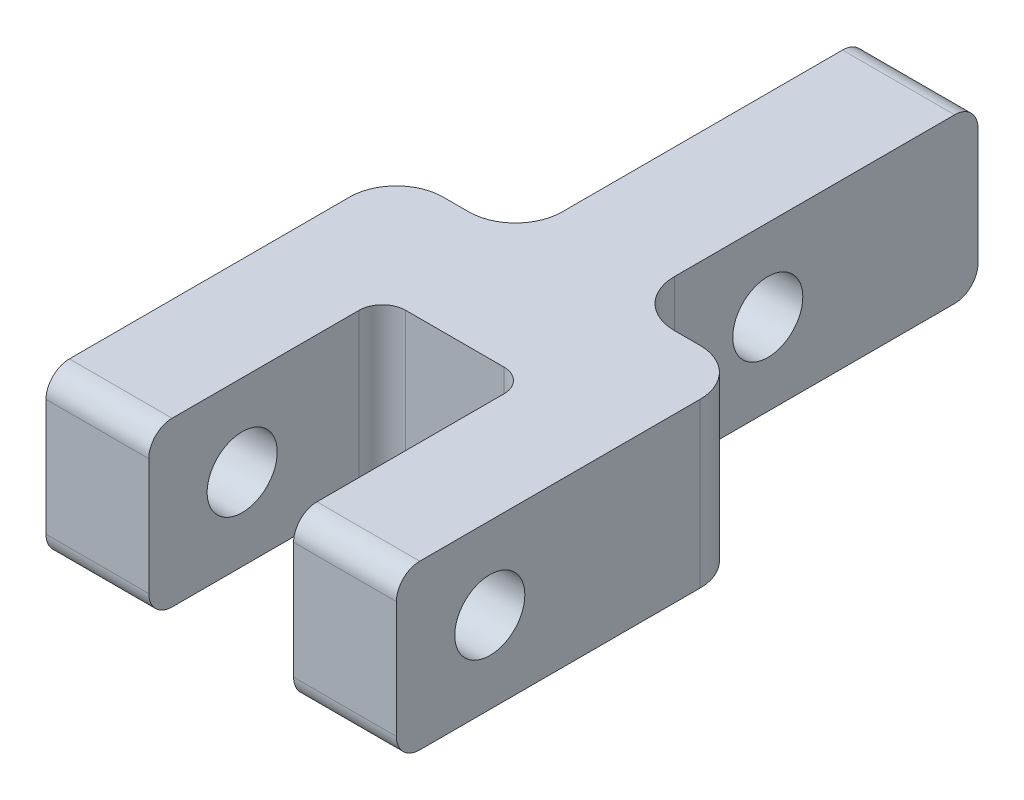
ISO-10303-21;
HEADER;
FILE_DESCRIPTION(('STEP AP214'),'2;1');
FILE_NAME('part.step','',(''),(''),'','','');
FILE_SCHEMA(('AUTOMOTIVE_DESIGN { 1 0 10303 214 1 1 1 1 }'));
ENDSEC;
DATA;
#1=APPLICATION_CONTEXT('core data for automotive mechanical design processes');
#2=APPLICATION_PROTOCOL_DEFINITION('international standard','automotive_design',2000,#1);
#3=PRODUCT_CONTEXT('',#1,'mechanical');
#4=PRODUCT('Part','Part','',(#3));
#5=PRODUCT_RELATED_PRODUCT_CATEGORY('part','',(#4));
#6=PRODUCT_DEFINITION_FORMATION('','',#4);
#7=PRODUCT_DEFINITION_CONTEXT('part definition',#1,'design');
#8=PRODUCT_DEFINITION('design','',#6,#7);
#9=PRODUCT_DEFINITION_SHAPE('','',#8);
#10=(LENGTH_UNIT() NAMED_UNIT(*) SI_UNIT(.MILLI.,.METRE.));
#11=(NAMED_UNIT(*) PLANE_ANGLE_UNIT() SI_UNIT($,.RADIAN.));
#12=(NAMED_UNIT(*) SI_UNIT($,.STERADIAN.) SOLID_ANGLE_UNIT());
#13=UNCERTAINTY_MEASURE_WITH_UNIT(LENGTH_MEASURE(1.E-05),#10,'distance_accuracy_value','');
#14=(GEOMETRIC_REPRESENTATION_CONTEXT(3) GLOBAL_UNCERTAINTY_ASSIGNED_CONTEXT((#13)) GLOBAL_UNIT_ASSIGNED_CONTEXT((#10,
#11,#12)) REPRESENTATION_CONTEXT('',''));
#15=CARTESIAN_POINT('',(0.,0.,0.));
#16=DIRECTION('',(0.,0.,1.));
#17=DIRECTION('',(1.,0.,0.));
#18=AXIS2_PLACEMENT_3D('',#15,#16,#17);
#19=CARTESIAN_POINT('',(2.4,-2.5,14.));
#20=DIRECTION('',(-1.,0.,0.));
#21=DIRECTION('',(0.,0.,1.));
#22=AXIS2_PLACEMENT_3D('',#19,#20,#21);
#23=CYLINDRICAL_SURFACE('',#22,0.999999999999999);
#24=CARTESIAN_POINT('',(-3.1,-2.5,14.));
#25=DIRECTION('',(1.,0.,0.));
#26=DIRECTION('',(0.,0.,-1.));
#27=AXIS2_PLACEMENT_3D('',#24,#25,#26);
#28=CIRCLE('',#27,0.999999999999999);
#29=CARTESIAN_POINT('',(-3.1,-2.5,15.));
#30=VERTEX_POINT('',#29);
#31=CARTESIAN_POINT('',(-3.1,-3.5,14.));
#32=VERTEX_POINT('',#31);
#33=EDGE_CURVE('E213',#30,#32,#28,.T.);
#34=ORIENTED_EDGE('',*,*,#33,.F.);
#35=DIRECTION('',(-1.,0.,0.));
#36=VECTOR('',#35,1.);
#37=CARTESIAN_POINT('',(2.4,-2.5,15.));
#38=LINE('',#37,#36);
#39=CARTESIAN_POINT('',(-7.5,-2.5,15.));
#40=VERTEX_POINT('',#39);
#41=EDGE_CURVE('E212',#30,#40,#38,.T.);
#42=ORIENTED_EDGE('',*,*,#41,.T.);
#43=CARTESIAN_POINT('',(-7.5,-2.5,14.));
#44=DIRECTION('',(1.,0.,0.));
#45=DIRECTION('',(0.,0.,-1.));
#46=AXIS2_PLACEMENT_3D('',#43,#44,#45);
#47=CIRCLE('',#46,0.999999999999999);
#48=CARTESIAN_POINT('',(-7.5,-3.5,14.));
#49=VERTEX_POINT('',#48);
#50=EDGE_CURVE('E358',#40,#49,#47,.T.);
#51=ORIENTED_EDGE('',*,*,#50,.T.);
#52=DIRECTION('',(-1.,0.,0.));
#53=VECTOR('',#52,1.);
#54=CARTESIAN_POINT('',(2.4,-3.5,14.));
#55=LINE('',#54,#53);
#56=EDGE_CURVE('E243',#32,#49,#55,.T.);
#57=ORIENTED_EDGE('',*,*,#56,.F.);
#58=EDGE_LOOP('',(#34,#42,#51,#57));
#59=FACE_BOUND('',#58,.T.);
#60=ADVANCED_FACE('F32',(#59),#23,.T.);
#61=CARTESIAN_POINT('',(2.4,-3.5,14.));
#62=DIRECTION('',(0.,1.,0.));
#63=DIRECTION('',(0.,0.,1.));
#64=AXIS2_PLACEMENT_3D('',#61,#62,#63);
#65=PLANE('',#64);
#66=DIRECTION('',(-1.,0.,0.));
#67=VECTOR('',#66,1.);
#68=CARTESIAN_POINT('',(7.5,-3.5,0.));
#69=LINE('',#68,#67);
#70=CARTESIAN_POINT('',(5.5,-3.5,0.));
#71=VERTEX_POINT('',#70);
#72=CARTESIAN_POINT('',(4.4,-3.5,0.));
#73=VERTEX_POINT('',#72);
#74=EDGE_CURVE('E371',#71,#73,#69,.T.);
#75=ORIENTED_EDGE('',*,*,#74,.F.);
#76=CARTESIAN_POINT('',(5.5,-3.5,2.));
#77=DIRECTION('',(0.,1.,0.));
#78=DIRECTION('',(0.,0.,1.));
#79=AXIS2_PLACEMENT_3D('',#76,#77,#78);
#80=CIRCLE('',#79,2.);
#81=CARTESIAN_POINT('',(7.5,-3.5,2.));
#82=VERTEX_POINT('',#81);
#83=EDGE_CURVE('E268',#71,#82,#80,.F.);
#84=ORIENTED_EDGE('',*,*,#83,.T.);
#85=DIRECTION('',(0.,0.,-1.));
#86=VECTOR('',#85,1.);
#87=CARTESIAN_POINT('',(7.5,-3.5,0.));
#88=LINE('',#87,#86);
#89=CARTESIAN_POINT('',(7.5,-3.5,14.));
#90=VERTEX_POINT('',#89);
#91=EDGE_CURVE('E349',#90,#82,#88,.T.);
#92=ORIENTED_EDGE('',*,*,#91,.F.);
#93=CARTESIAN_POINT('',(3.1,-3.5,14.));
#94=VERTEX_POINT('',#93);
#95=EDGE_CURVE('E244',#90,#94,#55,.T.);
#96=ORIENTED_EDGE('',*,*,#95,.T.);
#97=DIRECTION('',(0.,0.,-1.));
#98=VECTOR('',#97,1.);
#99=CARTESIAN_POINT('',(3.1,-3.5,4.99999999999999));
#100=LINE('',#99,#98);
#101=CARTESIAN_POINT('',(3.1,-3.5,5.99999999999999));
#102=VERTEX_POINT('',#101);
#103=EDGE_CURVE('E329',#94,#102,#100,.T.);
#104=ORIENTED_EDGE('',*,*,#103,.T.);
#105=CARTESIAN_POINT('',(2.1,-3.5,5.99999999999999));
#106=DIRECTION('',(0.,1.,0.));
#107=DIRECTION('',(0.,0.,1.));
#108=AXIS2_PLACEMENT_3D('',#105,#106,#107);
#109=CIRCLE('',#108,1.);
#110=CARTESIAN_POINT('',(2.1,-3.5,4.99999999999999));
#111=VERTEX_POINT('',#110);
#112=EDGE_CURVE('E302',#102,#111,#109,.T.);
#113=ORIENTED_EDGE('',*,*,#112,.T.);
#114=DIRECTION('',(1.,0.,0.));
#115=VECTOR('',#114,1.);
#116=CARTESIAN_POINT('',(-3.1,-3.5,4.99999999999999));
#117=LINE('',#116,#115);
#118=CARTESIAN_POINT('',(-2.1,-3.5,4.99999999999999));
#119=VERTEX_POINT('',#118);
#120=EDGE_CURVE('E312',#119,#111,#117,.T.);
#121=ORIENTED_EDGE('',*,*,#120,.F.);
#122=CARTESIAN_POINT('',(-2.1,-3.5,5.99999999999999));
#123=DIRECTION('',(0.,1.,0.));
#124=DIRECTION('',(0.,0.,1.));
#125=AXIS2_PLACEMENT_3D('',#122,#123,#124);
#126=CIRCLE('',#125,1.);
#127=CARTESIAN_POINT('',(-3.1,-3.5,5.99999999999999));
#128=VERTEX_POINT('',#127);
#129=EDGE_CURVE('E11',#119,#128,#126,.T.);
#130=ORIENTED_EDGE('',*,*,#129,.T.);
#131=DIRECTION('',(0.,0.,-1.));
#132=VECTOR('',#131,1.);
#133=CARTESIAN_POINT('',(-3.1,-3.5,4.99999999999999));
#134=LINE('',#133,#132);
#135=EDGE_CURVE('E314',#32,#128,#134,.T.);
#136=ORIENTED_EDGE('',*,*,#135,.F.);
#137=ORIENTED_EDGE('',*,*,#56,.T.);
#138=DIRECTION('',(0.,0.,-1.));
#139=VECTOR('',#138,1.);
#140=CARTESIAN_POINT('',(-7.5,-3.5,0.));
#141=LINE('',#140,#139);
#142=CARTESIAN_POINT('',(-7.5,-3.5,2.));
#143=VERTEX_POINT('',#142);
#144=EDGE_CURVE('E361',#49,#143,#141,.T.);
#145=ORIENTED_EDGE('',*,*,#144,.T.);
#146=CARTESIAN_POINT('',(-5.5,-3.5,2.));
#147=DIRECTION('',(0.,1.,0.));
#148=DIRECTION('',(0.,0.,1.));
#149=AXIS2_PLACEMENT_3D('',#146,#147,#148);
#150=CIRCLE('',#149,2.);
#151=CARTESIAN_POINT('',(-5.5,-3.5,0.));
#152=VERTEX_POINT('',#151);
#153=EDGE_CURVE('E266',#143,#152,#150,.F.);
#154=ORIENTED_EDGE('',*,*,#153,.T.);
#155=CARTESIAN_POINT('',(-4.4,-3.5,0.));
#156=VERTEX_POINT('',#155);
#157=EDGE_CURVE('E368',#156,#152,#69,.T.);
#158=ORIENTED_EDGE('',*,*,#157,.F.);
#159=CARTESIAN_POINT('',(-4.4,-3.5,-2.));
#160=DIRECTION('',(0.,1.,0.));
#161=DIRECTION('',(0.,0.,1.));
#162=AXIS2_PLACEMENT_3D('',#159,#160,#161);
#163=CIRCLE('',#162,2.);
#164=CARTESIAN_POINT('',(-2.4,-3.5,-2.));
#165=VERTEX_POINT('',#164);
#166=EDGE_CURVE('E287',#156,#165,#163,.T.);
#167=ORIENTED_EDGE('',*,*,#166,.T.);
#168=DIRECTION('',(0.,0.,-1.));
#169=VECTOR('',#168,1.);
#170=CARTESIAN_POINT('',(-2.4,-3.5,14.));
#171=LINE('',#170,#169);
#172=CARTESIAN_POINT('',(-2.4,-3.5,-14.));
#173=VERTEX_POINT('',#172);
#174=EDGE_CURVE('E378',#165,#173,#171,.T.);
#175=ORIENTED_EDGE('',*,*,#174,.T.);
#176=DIRECTION('',(-1.,0.,0.));
#177=VECTOR('',#176,1.);
#178=CARTESIAN_POINT('',(2.4,-3.5,-14.));
#179=LINE('',#178,#177);
#180=CARTESIAN_POINT('',(2.4,-3.5,-14.));
#181=VERTEX_POINT('',#180);
#182=EDGE_CURVE('E240',#181,#173,#179,.T.);
#183=ORIENTED_EDGE('',*,*,#182,.F.);
#184=DIRECTION('',(0.,0.,-1.));
#185=VECTOR('',#184,1.);
#186=CARTESIAN_POINT('',(2.4,-3.5,14.));
#187=LINE('',#186,#185);
#188=CARTESIAN_POINT('',(2.4,-3.5,-1.99999999999999));
#189=VERTEX_POINT('',#188);
#190=EDGE_CURVE('E379',#189,#181,#187,.T.);
#191=ORIENTED_EDGE('',*,*,#190,.F.);
#192=CARTESIAN_POINT('',(4.4,-3.5,-2.));
#193=DIRECTION('',(0.,1.,0.));
#194=DIRECTION('',(0.,0.,1.));
#195=AXIS2_PLACEMENT_3D('',#192,#193,#194);
#196=CIRCLE('',#195,2.);
#197=EDGE_CURVE('E283',#189,#73,#196,.T.);
#198=ORIENTED_EDGE('',*,*,#197,.T.);
#199=EDGE_LOOP('',(#75,#84,#92,#96,#104,#113,#121,#130,#136,#137,#145,#154,#158,#167,#175,#183,
#191,#198));
#200=FACE_BOUND('',#199,.T.);
#201=ADVANCED_FACE('F414',(#200),#65,.F.);
#202=CARTESIAN_POINT('',(2.4,3.5,14.));
#203=DIRECTION('',(0.,-1.,0.));
#204=DIRECTION('',(0.,0.,-1.));
#205=AXIS2_PLACEMENT_3D('',#202,#203,#204);
#206=PLANE('',#205);
#207=DIRECTION('',(0.,0.,1.));
#208=VECTOR('',#207,1.);
#209=CARTESIAN_POINT('',(7.5,3.5,14.));
#210=LINE('',#209,#208);
#211=CARTESIAN_POINT('',(7.5,3.5,2.));
#212=VERTEX_POINT('',#211);
#213=CARTESIAN_POINT('',(7.5,3.5,14.));
#214=VERTEX_POINT('',#213);
#215=EDGE_CURVE('E352',#212,#214,#210,.T.);
#216=ORIENTED_EDGE('',*,*,#215,.F.);
#217=CARTESIAN_POINT('',(5.5,3.5,2.));
#218=DIRECTION('',(0.,-1.,0.));
#219=DIRECTION('',(0.,0.,-1.));
#220=AXIS2_PLACEMENT_3D('',#217,#218,#219);
#221=CIRCLE('',#220,2.);
#222=CARTESIAN_POINT('',(5.5,3.5,0.));
#223=VERTEX_POINT('',#222);
#224=EDGE_CURVE('E260',#212,#223,#221,.F.);
#225=ORIENTED_EDGE('',*,*,#224,.T.);
#226=DIRECTION('',(-1.,0.,0.));
#227=VECTOR('',#226,1.);
#228=CARTESIAN_POINT('',(7.5,3.5,0.));
#229=LINE('',#228,#227);
#230=CARTESIAN_POINT('',(4.4,3.5,0.));
#231=VERTEX_POINT('',#230);
#232=EDGE_CURVE('E367',#223,#231,#229,.T.);
#233=ORIENTED_EDGE('',*,*,#232,.T.);
#234=CARTESIAN_POINT('',(4.4,3.5,-2.));
#235=DIRECTION('',(0.,-1.,0.));
#236=DIRECTION('',(0.,0.,-1.));
#237=AXIS2_PLACEMENT_3D('',#234,#235,#236);
#238=CIRCLE('',#237,2.);
#239=CARTESIAN_POINT('',(2.4,3.5,-1.99999999999999));
#240=VERTEX_POINT('',#239);
#241=EDGE_CURVE('E285',#231,#240,#238,.T.);
#242=ORIENTED_EDGE('',*,*,#241,.T.);
#243=DIRECTION('',(0.,0.,1.));
#244=VECTOR('',#243,1.);
#245=CARTESIAN_POINT('',(2.4,3.5,14.));
#246=LINE('',#245,#244);
#247=CARTESIAN_POINT('',(2.4,3.5,-14.));
#248=VERTEX_POINT('',#247);
#249=EDGE_CURVE('E388',#248,#240,#246,.T.);
#250=ORIENTED_EDGE('',*,*,#249,.F.);
#251=DIRECTION('',(-1.,0.,0.));
#252=VECTOR('',#251,1.);
#253=CARTESIAN_POINT('',(2.4,3.5,-14.));
#254=LINE('',#253,#252);
#255=CARTESIAN_POINT('',(-2.4,3.5,-14.));
#256=VERTEX_POINT('',#255);
#257=EDGE_CURVE('E231',#248,#256,#254,.T.);
#258=ORIENTED_EDGE('',*,*,#257,.T.);
#259=DIRECTION('',(0.,0.,1.));
#260=VECTOR('',#259,1.);
#261=CARTESIAN_POINT('',(-2.4,3.5,14.));
#262=LINE('',#261,#260);
#263=CARTESIAN_POINT('',(-2.4,3.5,-1.99999999999999));
#264=VERTEX_POINT('',#263);
#265=EDGE_CURVE('E382',#256,#264,#262,.T.);
#266=ORIENTED_EDGE('',*,*,#265,.T.);
#267=CARTESIAN_POINT('',(-4.4,3.5,-2.));
#268=DIRECTION('',(0.,-1.,0.));
#269=DIRECTION('',(0.,0.,-1.));
#270=AXIS2_PLACEMENT_3D('',#267,#268,#269);
#271=CIRCLE('',#270,2.);
#272=CARTESIAN_POINT('',(-4.4,3.5,0.));
#273=VERTEX_POINT('',#272);
#274=EDGE_CURVE('E289',#264,#273,#271,.T.);
#275=ORIENTED_EDGE('',*,*,#274,.T.);
#276=CARTESIAN_POINT('',(-5.5,3.5,0.));
#277=VERTEX_POINT('',#276);
#278=EDGE_CURVE('E354',#273,#277,#229,.T.);
#279=ORIENTED_EDGE('',*,*,#278,.T.);
#280=CARTESIAN_POINT('',(-5.5,3.5,2.));
#281=DIRECTION('',(0.,-1.,0.));
#282=DIRECTION('',(0.,0.,-1.));
#283=AXIS2_PLACEMENT_3D('',#280,#281,#282);
#284=CIRCLE('',#283,2.);
#285=CARTESIAN_POINT('',(-7.5,3.5,2.));
#286=VERTEX_POINT('',#285);
#287=EDGE_CURVE('E258',#277,#286,#284,.F.);
#288=ORIENTED_EDGE('',*,*,#287,.T.);
#289=DIRECTION('',(0.,0.,1.));
#290=VECTOR('',#289,1.);
#291=CARTESIAN_POINT('',(-7.5,3.5,14.));
#292=LINE('',#291,#290);
#293=CARTESIAN_POINT('',(-7.5,3.5,14.));
#294=VERTEX_POINT('',#293);
#295=EDGE_CURVE('E343',#286,#294,#292,.T.);
#296=ORIENTED_EDGE('',*,*,#295,.T.);
#297=DIRECTION('',(-1.,0.,0.));
#298=VECTOR('',#297,1.);
#299=CARTESIAN_POINT('',(2.4,3.5,14.));
#300=LINE('',#299,#298);
#301=CARTESIAN_POINT('',(-3.1,3.5,14.));
#302=VERTEX_POINT('',#301);
#303=EDGE_CURVE('E223',#302,#294,#300,.T.);
#304=ORIENTED_EDGE('',*,*,#303,.F.);
#305=DIRECTION('',(0.,0.,1.));
#306=VECTOR('',#305,1.);
#307=CARTESIAN_POINT('',(-3.1,3.5,14.));
#308=LINE('',#307,#306);
#309=CARTESIAN_POINT('',(-3.1,3.5,5.99999999999999));
#310=VERTEX_POINT('',#309);
#311=EDGE_CURVE('E199',#310,#302,#308,.T.);
#312=ORIENTED_EDGE('',*,*,#311,.F.);
#313=CARTESIAN_POINT('',(-2.1,3.5,5.99999999999999));
#314=DIRECTION('',(0.,-1.,0.));
#315=DIRECTION('',(0.,0.,-1.));
#316=AXIS2_PLACEMENT_3D('',#313,#314,#315);
#317=CIRCLE('',#316,1.);
#318=CARTESIAN_POINT('',(-2.1,3.5,4.99999999999999));
#319=VERTEX_POINT('',#318);
#320=EDGE_CURVE('E40',#310,#319,#317,.T.);
#321=ORIENTED_EDGE('',*,*,#320,.T.);
#322=DIRECTION('',(1.,0.,0.));
#323=VECTOR('',#322,1.);
#324=CARTESIAN_POINT('',(-3.1,3.5,4.99999999999999));
#325=LINE('',#324,#323);
#326=CARTESIAN_POINT('',(2.1,3.5,4.99999999999999));
#327=VERTEX_POINT('',#326);
#328=EDGE_CURVE('E252',#319,#327,#325,.T.);
#329=ORIENTED_EDGE('',*,*,#328,.T.);
#330=CARTESIAN_POINT('',(2.1,3.5,5.99999999999999));
#331=DIRECTION('',(0.,-1.,0.));
#332=DIRECTION('',(0.,0.,-1.));
#333=AXIS2_PLACEMENT_3D('',#330,#331,#332);
#334=CIRCLE('',#333,1.);
#335=CARTESIAN_POINT('',(3.1,3.5,5.99999999999999));
#336=VERTEX_POINT('',#335);
#337=EDGE_CURVE('E300',#327,#336,#334,.T.);
#338=ORIENTED_EDGE('',*,*,#337,.T.);
#339=DIRECTION('',(0.,0.,1.));
#340=VECTOR('',#339,1.);
#341=CARTESIAN_POINT('',(3.1,3.5,14.));
#342=LINE('',#341,#340);
#343=CARTESIAN_POINT('',(3.1,3.5,14.));
#344=VERTEX_POINT('',#343);
#345=EDGE_CURVE('E204',#336,#344,#342,.T.);
#346=ORIENTED_EDGE('',*,*,#345,.T.);
#347=EDGE_CURVE('E228',#214,#344,#300,.T.);
#348=ORIENTED_EDGE('',*,*,#347,.F.);
#349=EDGE_LOOP('',(#216,#225,#233,#242,#250,#258,#266,#275,#279,#288,#296,#304,#312,#321,#329,
#338,#346,#348));
#350=FACE_BOUND('',#349,.T.);
#351=ADVANCED_FACE('F307',(#350),#206,.F.);
#352=CARTESIAN_POINT('',(2.4,2.5,14.));
#353=DIRECTION('',(-1.,0.,0.));
#354=DIRECTION('',(0.,0.,1.));
#355=AXIS2_PLACEMENT_3D('',#352,#353,#354);
#356=CYLINDRICAL_SURFACE('',#355,0.999999999999999);
#357=CARTESIAN_POINT('',(-3.1,2.5,14.));
#358=DIRECTION('',(1.,0.,0.));
#359=DIRECTION('',(0.,0.,-1.));
#360=AXIS2_PLACEMENT_3D('',#357,#358,#359);
#361=CIRCLE('',#360,0.999999999999998);
#362=CARTESIAN_POINT('',(-3.1,2.5,15.));
#363=VERTEX_POINT('',#362);
#364=EDGE_CURVE('E192',#302,#363,#361,.T.);
#365=ORIENTED_EDGE('',*,*,#364,.F.);
#366=ORIENTED_EDGE('',*,*,#303,.T.);
#367=CARTESIAN_POINT('',(-7.5,2.5,14.));
#368=DIRECTION('',(1.,0.,0.));
#369=DIRECTION('',(0.,0.,-1.));
#370=AXIS2_PLACEMENT_3D('',#367,#368,#369);
#371=CIRCLE('',#370,0.999999999999998);
#372=CARTESIAN_POINT('',(-7.5,2.5,15.));
#373=VERTEX_POINT('',#372);
#374=EDGE_CURVE('E218',#294,#373,#371,.T.);
#375=ORIENTED_EDGE('',*,*,#374,.T.);
#376=DIRECTION('',(-1.,0.,0.));
#377=VECTOR('',#376,1.);
#378=CARTESIAN_POINT('',(2.4,2.5,15.));
#379=LINE('',#378,#377);
#380=EDGE_CURVE('E210',#363,#373,#379,.T.);
#381=ORIENTED_EDGE('',*,*,#380,.F.);
#382=EDGE_LOOP('',(#365,#366,#375,#381));
#383=FACE_BOUND('',#382,.T.);
#384=ADVANCED_FACE('F216',(#383),#356,.T.);
#385=CARTESIAN_POINT('',(2.4,2.5,15.));
#386=DIRECTION('',(0.,0.,-1.));
#387=DIRECTION('',(-1.,0.,0.));
#388=AXIS2_PLACEMENT_3D('',#385,#386,#387);
#389=PLANE('',#388);
#390=DIRECTION('',(0.,-1.,0.));
#391=VECTOR('',#390,1.);
#392=CARTESIAN_POINT('',(-3.1,2.5,15.));
#393=LINE('',#392,#391);
#394=EDGE_CURVE('E196',#363,#30,#393,.T.);
#395=ORIENTED_EDGE('',*,*,#394,.F.);
#396=ORIENTED_EDGE('',*,*,#380,.T.);
#397=DIRECTION('',(0.,-1.,0.));
#398=VECTOR('',#397,1.);
#399=CARTESIAN_POINT('',(-7.5,2.5,15.));
#400=LINE('',#399,#398);
#401=EDGE_CURVE('E356',#373,#40,#400,.T.);
#402=ORIENTED_EDGE('',*,*,#401,.T.);
#403=ORIENTED_EDGE('',*,*,#41,.F.);
#404=EDGE_LOOP('',(#395,#396,#402,#403));
#405=FACE_BOUND('',#404,.T.);
#406=ADVANCED_FACE('F208',(#405),#389,.F.);
#407=CARTESIAN_POINT('',(-2.4,0.,11.));
#408=DIRECTION('',(1.,0.,0.));
#409=DIRECTION('',(0.,0.,-1.));
#410=AXIS2_PLACEMENT_3D('',#407,#408,#409);
#411=CYLINDRICAL_SURFACE('',#410,1.5);
#412=CARTESIAN_POINT('',(-7.5,0.,11.));
#413=DIRECTION('',(1.,0.,0.));
#414=DIRECTION('',(0.,0.,-1.));
#415=AXIS2_PLACEMENT_3D('',#412,#413,#414);
#416=CIRCLE('',#415,1.5);
#417=CARTESIAN_POINT('',(-7.5,0.,9.49999999999999));
#418=VERTEX_POINT('',#417);
#419=EDGE_CURVE('E255',#418,#418,#416,.T.);
#420=ORIENTED_EDGE('',*,*,#419,.F.);
#421=EDGE_LOOP('',(#420));
#422=FACE_BOUND('',#421,.T.);
#423=CARTESIAN_POINT('',(-3.1,0.,11.));
#424=DIRECTION('',(1.,0.,0.));
#425=DIRECTION('',(0.,0.,-1.));
#426=AXIS2_PLACEMENT_3D('',#423,#424,#425);
#427=CIRCLE('',#426,1.5);
#428=CARTESIAN_POINT('',(-3.1,0.,9.49999999999999));
#429=VERTEX_POINT('',#428);
#430=EDGE_CURVE('E251',#429,#429,#427,.F.);
#431=ORIENTED_EDGE('',*,*,#430,.F.);
#432=EDGE_LOOP('',(#431));
#433=FACE_BOUND('',#432,.T.);
#434=ADVANCED_FACE('F514',(#422,#433),#411,.F.);
#435=CARTESIAN_POINT('',(2.4,-2.5,14.));
#436=DIRECTION('',(1.,0.,0.));
#437=DIRECTION('',(0.,0.,-1.));
#438=AXIS2_PLACEMENT_3D('',#435,#436,#437);
#439=PLANE('',#438);
#440=CARTESIAN_POINT('',(2.4,0.,-6.));
#441=DIRECTION('',(1.,0.,0.));
#442=DIRECTION('',(0.,0.,-1.));
#443=AXIS2_PLACEMENT_3D('',#440,#441,#442);
#444=CIRCLE('',#443,1.5);
#445=CARTESIAN_POINT('',(2.4,0.,-7.5));
#446=VERTEX_POINT('',#445);
#447=EDGE_CURVE('E372',#446,#446,#444,.T.);
#448=ORIENTED_EDGE('',*,*,#447,.F.);
#449=EDGE_LOOP('',(#448));
#450=FACE_BOUND('',#449,.T.);
#451=ORIENTED_EDGE('',*,*,#249,.T.);
#452=DIRECTION('',(0.,-1.,0.));
#453=VECTOR('',#452,1.);
#454=CARTESIAN_POINT('',(2.4,-2.5,-2.));
#455=LINE('',#454,#453);
#456=EDGE_CURVE('E278',#240,#189,#455,.T.);
#457=ORIENTED_EDGE('',*,*,#456,.T.);
#458=ORIENTED_EDGE('',*,*,#190,.T.);
#459=CARTESIAN_POINT('',(2.4,-2.5,-14.));
#460=DIRECTION('',(1.,0.,0.));
#461=DIRECTION('',(0.,0.,-1.));
#462=AXIS2_PLACEMENT_3D('',#459,#460,#461);
#463=CIRCLE('',#462,1.);
#464=CARTESIAN_POINT('',(2.4,-2.5,-15.));
#465=VERTEX_POINT('',#464);
#466=EDGE_CURVE('E381',#181,#465,#463,.T.);
#467=ORIENTED_EDGE('',*,*,#466,.T.);
#468=DIRECTION('',(0.,1.,0.));
#469=VECTOR('',#468,1.);
#470=CARTESIAN_POINT('',(2.4,2.5,-15.));
#471=LINE('',#470,#469);
#472=CARTESIAN_POINT('',(2.4,2.5,-15.));
#473=VERTEX_POINT('',#472);
#474=EDGE_CURVE('E384',#465,#473,#471,.T.);
#475=ORIENTED_EDGE('',*,*,#474,.T.);
#476=CARTESIAN_POINT('',(2.4,2.5,-14.));
#477=DIRECTION('',(1.,0.,0.));
#478=DIRECTION('',(0.,0.,1.));
#479=AXIS2_PLACEMENT_3D('',#476,#477,#478);
#480=CIRCLE('',#479,1.);
#481=EDGE_CURVE('E386',#473,#248,#480,.T.);
#482=ORIENTED_EDGE('',*,*,#481,.T.);
#483=EDGE_LOOP('',(#451,#457,#458,#467,#475,#482));
#484=FACE_BOUND('',#483,.T.);
#485=ADVANCED_FACE('F446',(#450,#484),#439,.T.);
#486=CARTESIAN_POINT('',(-2.4,-2.5,14.));
#487=DIRECTION('',(1.,0.,0.));
#488=DIRECTION('',(0.,0.,-1.));
#489=AXIS2_PLACEMENT_3D('',#486,#487,#488);
#490=PLANE('',#489);
#491=CARTESIAN_POINT('',(-2.4,0.,-6.));
#492=DIRECTION('',(1.,0.,0.));
#493=DIRECTION('',(0.,0.,-1.));
#494=AXIS2_PLACEMENT_3D('',#491,#492,#493);
#495=CIRCLE('',#494,1.5);
#496=CARTESIAN_POINT('',(-2.4,0.,-7.5));
#497=VERTEX_POINT('',#496);
#498=EDGE_CURVE('E375',#497,#497,#495,.T.);
#499=ORIENTED_EDGE('',*,*,#498,.T.);
#500=EDGE_LOOP('',(#499));
#501=FACE_BOUND('',#500,.T.);
#502=ORIENTED_EDGE('',*,*,#174,.F.);
#503=DIRECTION('',(0.,-1.,0.));
#504=VECTOR('',#503,1.);
#505=CARTESIAN_POINT('',(-2.4,3.5,-2.));
#506=LINE('',#505,#504);
#507=EDGE_CURVE('E281',#165,#264,#506,.F.);
#508=ORIENTED_EDGE('',*,*,#507,.T.);
#509=ORIENTED_EDGE('',*,*,#265,.F.);
#510=CARTESIAN_POINT('',(-2.4,2.5,-14.));
#511=DIRECTION('',(1.,0.,0.));
#512=DIRECTION('',(0.,0.,1.));
#513=AXIS2_PLACEMENT_3D('',#510,#511,#512);
#514=CIRCLE('',#513,1.);
#515=CARTESIAN_POINT('',(-2.4,2.5,-15.));
#516=VERTEX_POINT('',#515);
#517=EDGE_CURVE('E396',#516,#256,#514,.T.);
#518=ORIENTED_EDGE('',*,*,#517,.F.);
#519=DIRECTION('',(0.,1.,0.));
#520=VECTOR('',#519,1.);
#521=CARTESIAN_POINT('',(-2.4,2.5,-15.));
#522=LINE('',#521,#520);
#523=CARTESIAN_POINT('',(-2.4,-2.5,-15.));
#524=VERTEX_POINT('',#523);
#525=EDGE_CURVE('E394',#524,#516,#522,.T.);
#526=ORIENTED_EDGE('',*,*,#525,.F.);
#527=CARTESIAN_POINT('',(-2.4,-2.5,-14.));
#528=DIRECTION('',(1.,0.,0.));
#529=DIRECTION('',(0.,0.,-1.));
#530=AXIS2_PLACEMENT_3D('',#527,#528,#529);
#531=CIRCLE('',#530,1.);
#532=EDGE_CURVE('E392',#173,#524,#531,.T.);
#533=ORIENTED_EDGE('',*,*,#532,.F.);
#534=EDGE_LOOP('',(#502,#508,#509,#518,#526,#533));
#535=FACE_BOUND('',#534,.T.);
#536=ADVANCED_FACE('F437',(#501,#535),#490,.F.);
#537=CARTESIAN_POINT('',(7.5,-2.5,15.));
#538=VERTEX_POINT('',#537);
#539=CARTESIAN_POINT('',(3.1,-2.5,15.));
#540=VERTEX_POINT('',#539);
#541=EDGE_CURVE('E220',#538,#540,#38,.T.);
#542=ORIENTED_EDGE('',*,*,#541,.T.);
#543=CARTESIAN_POINT('',(3.1,-2.5,14.));
#544=DIRECTION('',(1.,0.,0.));
#545=DIRECTION('',(0.,0.,-1.));
#546=AXIS2_PLACEMENT_3D('',#543,#544,#545);
#547=CIRCLE('',#546,0.999999999999999);
#548=EDGE_CURVE('E326',#540,#94,#547,.T.);
#549=ORIENTED_EDGE('',*,*,#548,.T.);
#550=ORIENTED_EDGE('',*,*,#95,.F.);
#551=CARTESIAN_POINT('',(7.5,-2.5,14.));
#552=DIRECTION('',(1.,0.,0.));
#553=DIRECTION('',(0.,0.,-1.));
#554=AXIS2_PLACEMENT_3D('',#551,#552,#553);
#555=CIRCLE('',#554,0.999999999999999);
#556=EDGE_CURVE('E346',#538,#90,#555,.T.);
#557=ORIENTED_EDGE('',*,*,#556,.F.);
#558=EDGE_LOOP('',(#542,#549,#550,#557));
#559=FACE_BOUND('',#558,.T.);
#560=ADVANCED_FACE('F429',(#559),#23,.T.);
#561=CARTESIAN_POINT('',(2.4,-2.5,-14.));
#562=DIRECTION('',(-1.,0.,0.));
#563=DIRECTION('',(0.,0.,1.));
#564=AXIS2_PLACEMENT_3D('',#561,#562,#563);
#565=CYLINDRICAL_SURFACE('',#564,1.);
#566=ORIENTED_EDGE('',*,*,#532,.T.);
#567=DIRECTION('',(-1.,0.,0.));
#568=VECTOR('',#567,1.);
#569=CARTESIAN_POINT('',(2.4,-2.5,-15.));
#570=LINE('',#569,#568);
#571=EDGE_CURVE('E237',#465,#524,#570,.T.);
#572=ORIENTED_EDGE('',*,*,#571,.F.);
#573=ORIENTED_EDGE('',*,*,#466,.F.);
#574=ORIENTED_EDGE('',*,*,#182,.T.);
#575=EDGE_LOOP('',(#566,#572,#573,#574));
#576=FACE_BOUND('',#575,.T.);
#577=ADVANCED_FACE('F436',(#576),#565,.T.);
#578=CARTESIAN_POINT('',(2.4,2.5,-15.));
#579=DIRECTION('',(0.,0.,1.));
#580=DIRECTION('',(1.,0.,0.));
#581=AXIS2_PLACEMENT_3D('',#578,#579,#580);
#582=PLANE('',#581);
#583=ORIENTED_EDGE('',*,*,#525,.T.);
#584=DIRECTION('',(-1.,0.,0.));
#585=VECTOR('',#584,1.);
#586=CARTESIAN_POINT('',(2.4,2.5,-15.));
#587=LINE('',#586,#585);
#588=EDGE_CURVE('E234',#473,#516,#587,.T.);
#589=ORIENTED_EDGE('',*,*,#588,.F.);
#590=ORIENTED_EDGE('',*,*,#474,.F.);
#591=ORIENTED_EDGE('',*,*,#571,.T.);
#592=EDGE_LOOP('',(#583,#589,#590,#591));
#593=FACE_BOUND('',#592,.T.);
#594=ADVANCED_FACE('F443',(#593),#582,.F.);
#595=CARTESIAN_POINT('',(2.4,2.5,-14.));
#596=DIRECTION('',(-1.,0.,0.));
#597=DIRECTION('',(0.,0.,1.));
#598=AXIS2_PLACEMENT_3D('',#595,#596,#597);
#599=CYLINDRICAL_SURFACE('',#598,1.);
#600=ORIENTED_EDGE('',*,*,#517,.T.);
#601=ORIENTED_EDGE('',*,*,#257,.F.);
#602=ORIENTED_EDGE('',*,*,#481,.F.);
#603=ORIENTED_EDGE('',*,*,#588,.T.);
#604=EDGE_LOOP('',(#600,#601,#602,#603));
#605=FACE_BOUND('',#604,.T.);
#606=ADVANCED_FACE('F491',(#605),#599,.T.);
#607=ORIENTED_EDGE('',*,*,#347,.T.);
#608=CARTESIAN_POINT('',(3.1,2.5,14.));
#609=DIRECTION('',(1.,0.,0.));
#610=DIRECTION('',(0.,0.,-1.));
#611=AXIS2_PLACEMENT_3D('',#608,#609,#610);
#612=CIRCLE('',#611,0.999999999999998);
#613=CARTESIAN_POINT('',(3.1,2.5,15.));
#614=VERTEX_POINT('',#613);
#615=EDGE_CURVE('E320',#344,#614,#612,.T.);
#616=ORIENTED_EDGE('',*,*,#615,.T.);
#617=CARTESIAN_POINT('',(7.5,2.5,15.));
#618=VERTEX_POINT('',#617);
#619=EDGE_CURVE('E219',#618,#614,#379,.T.);
#620=ORIENTED_EDGE('',*,*,#619,.F.);
#621=CARTESIAN_POINT('',(7.5,2.5,14.));
#622=DIRECTION('',(1.,0.,0.));
#623=DIRECTION('',(0.,0.,-1.));
#624=AXIS2_PLACEMENT_3D('',#621,#622,#623);
#625=CIRCLE('',#624,0.999999999999998);
#626=EDGE_CURVE('E339',#214,#618,#625,.T.);
#627=ORIENTED_EDGE('',*,*,#626,.F.);
#628=EDGE_LOOP('',(#607,#616,#620,#627));
#629=FACE_BOUND('',#628,.T.);
#630=ADVANCED_FACE('F460',(#629),#356,.T.);
#631=ORIENTED_EDGE('',*,*,#619,.T.);
#632=DIRECTION('',(0.,-1.,0.));
#633=VECTOR('',#632,1.);
#634=CARTESIAN_POINT('',(3.1,2.5,15.));
#635=LINE('',#634,#633);
#636=EDGE_CURVE('E323',#614,#540,#635,.T.);
#637=ORIENTED_EDGE('',*,*,#636,.T.);
#638=ORIENTED_EDGE('',*,*,#541,.F.);
#639=DIRECTION('',(0.,-1.,0.));
#640=VECTOR('',#639,1.);
#641=CARTESIAN_POINT('',(7.5,2.5,15.));
#642=LINE('',#641,#640);
#643=EDGE_CURVE('E342',#618,#538,#642,.T.);
#644=ORIENTED_EDGE('',*,*,#643,.F.);
#645=EDGE_LOOP('',(#631,#637,#638,#644));
#646=FACE_BOUND('',#645,.T.);
#647=ADVANCED_FACE('F452',(#646),#389,.F.);
#648=CARTESIAN_POINT('',(-2.4,0.,-6.));
#649=DIRECTION('',(1.,0.,0.));
#650=DIRECTION('',(0.,0.,-1.));
#651=AXIS2_PLACEMENT_3D('',#648,#649,#650);
#652=CYLINDRICAL_SURFACE('',#651,1.5);
#653=ORIENTED_EDGE('',*,*,#498,.F.);
#654=EDGE_LOOP('',(#653));
#655=FACE_BOUND('',#654,.T.);
#656=ORIENTED_EDGE('',*,*,#447,.T.);
#657=EDGE_LOOP('',(#656));
#658=FACE_BOUND('',#657,.T.);
#659=ADVANCED_FACE('F510',(#655,#658),#652,.F.);
#660=CARTESIAN_POINT('',(7.5,3.5,0.));
#661=DIRECTION('',(0.,0.,1.));
#662=DIRECTION('',(0.,-1.,0.));
#663=AXIS2_PLACEMENT_3D('',#660,#661,#662);
#664=PLANE('',#663);
#665=ORIENTED_EDGE('',*,*,#157,.T.);
#666=DIRECTION('',(0.,1.,0.));
#667=VECTOR('',#666,1.);
#668=CARTESIAN_POINT('',(-5.5,3.5,0.));
#669=LINE('',#668,#667);
#670=EDGE_CURVE('E273',#152,#277,#669,.T.);
#671=ORIENTED_EDGE('',*,*,#670,.T.);
#672=ORIENTED_EDGE('',*,*,#278,.F.);
#673=DIRECTION('',(0.,-1.,0.));
#674=VECTOR('',#673,1.);
#675=CARTESIAN_POINT('',(-4.4,-3.5,0.));
#676=LINE('',#675,#674);
#677=EDGE_CURVE('E270',#273,#156,#676,.T.);
#678=ORIENTED_EDGE('',*,*,#677,.T.);
#679=EDGE_LOOP('',(#665,#671,#672,#678));
#680=FACE_BOUND('',#679,.T.);
#681=ADVANCED_FACE('F411',(#680),#664,.F.);
#682=CARTESIAN_POINT('',(-7.5,2.5,14.));
#683=DIRECTION('',(1.,0.,0.));
#684=DIRECTION('',(0.,0.,-1.));
#685=AXIS2_PLACEMENT_3D('',#682,#683,#684);
#686=PLANE('',#685);
#687=ORIENTED_EDGE('',*,*,#295,.F.);
#688=DIRECTION('',(0.,1.,0.));
#689=VECTOR('',#688,1.);
#690=CARTESIAN_POINT('',(-7.5,2.5,2.));
#691=LINE('',#690,#689);
#692=EDGE_CURVE('E276',#286,#143,#691,.F.);
#693=ORIENTED_EDGE('',*,*,#692,.T.);
#694=ORIENTED_EDGE('',*,*,#144,.F.);
#695=ORIENTED_EDGE('',*,*,#50,.F.);
#696=ORIENTED_EDGE('',*,*,#401,.F.);
#697=ORIENTED_EDGE('',*,*,#374,.F.);
#698=EDGE_LOOP('',(#687,#693,#694,#695,#696,#697));
#699=FACE_BOUND('',#698,.T.);
#700=ORIENTED_EDGE('',*,*,#419,.T.);
#701=EDGE_LOOP('',(#700));
#702=FACE_BOUND('',#701,.T.);
#703=ADVANCED_FACE('F423',(#699,#702),#686,.F.);
#704=CARTESIAN_POINT('',(3.1,0.,11.));
#705=DIRECTION('',(1.,0.,0.));
#706=DIRECTION('',(0.,0.,-1.));
#707=AXIS2_PLACEMENT_3D('',#704,#705,#706);
#708=CIRCLE('',#707,1.5);
#709=CARTESIAN_POINT('',(3.1,0.,9.49999999999999));
#710=VERTEX_POINT('',#709);
#711=EDGE_CURVE('E248',#710,#710,#708,.F.);
#712=ORIENTED_EDGE('',*,*,#711,.T.);
#713=EDGE_LOOP('',(#712));
#714=FACE_BOUND('',#713,.T.);
#715=CARTESIAN_POINT('',(7.5,0.,11.));
#716=DIRECTION('',(1.,0.,0.));
#717=DIRECTION('',(0.,0.,-1.));
#718=AXIS2_PLACEMENT_3D('',#715,#716,#717);
#719=CIRCLE('',#718,1.5);
#720=CARTESIAN_POINT('',(7.5,0.,9.49999999999999));
#721=VERTEX_POINT('',#720);
#722=EDGE_CURVE('E334',#721,#721,#719,.T.);
#723=ORIENTED_EDGE('',*,*,#722,.T.);
#724=EDGE_LOOP('',(#723));
#725=FACE_BOUND('',#724,.T.);
#726=ADVANCED_FACE('F519',(#714,#725),#411,.F.);
#727=CARTESIAN_POINT('',(7.5,2.5,14.));
#728=DIRECTION('',(1.,0.,0.));
#729=DIRECTION('',(0.,0.,-1.));
#730=AXIS2_PLACEMENT_3D('',#727,#728,#729);
#731=PLANE('',#730);
#732=ORIENTED_EDGE('',*,*,#91,.T.);
#733=DIRECTION('',(0.,1.,0.));
#734=VECTOR('',#733,1.);
#735=CARTESIAN_POINT('',(7.5,3.5,2.));
#736=LINE('',#735,#734);
#737=EDGE_CURVE('E247',#82,#212,#736,.T.);
#738=ORIENTED_EDGE('',*,*,#737,.T.);
#739=ORIENTED_EDGE('',*,*,#215,.T.);
#740=ORIENTED_EDGE('',*,*,#626,.T.);
#741=ORIENTED_EDGE('',*,*,#643,.T.);
#742=ORIENTED_EDGE('',*,*,#556,.T.);
#743=EDGE_LOOP('',(#732,#738,#739,#740,#741,#742));
#744=FACE_BOUND('',#743,.T.);
#745=ORIENTED_EDGE('',*,*,#722,.F.);
#746=EDGE_LOOP('',(#745));
#747=FACE_BOUND('',#746,.T.);
#748=ADVANCED_FACE('F454',(#744,#747),#731,.T.);
#749=ORIENTED_EDGE('',*,*,#232,.F.);
#750=DIRECTION('',(0.,1.,0.));
#751=VECTOR('',#750,1.);
#752=CARTESIAN_POINT('',(5.5,-3.5,0.));
#753=LINE('',#752,#751);
#754=EDGE_CURVE('E264',#223,#71,#753,.F.);
#755=ORIENTED_EDGE('',*,*,#754,.T.);
#756=ORIENTED_EDGE('',*,*,#74,.T.);
#757=DIRECTION('',(0.,-1.,0.));
#758=VECTOR('',#757,1.);
#759=CARTESIAN_POINT('',(4.4,3.5,0.));
#760=LINE('',#759,#758);
#761=EDGE_CURVE('E262',#73,#231,#760,.F.);
#762=ORIENTED_EDGE('',*,*,#761,.T.);
#763=EDGE_LOOP('',(#749,#755,#756,#762));
#764=FACE_BOUND('',#763,.T.);
#765=ADVANCED_FACE('F477',(#764),#664,.F.);
#766=CARTESIAN_POINT('',(-3.1,2.5,14.));
#767=DIRECTION('',(1.,0.,0.));
#768=DIRECTION('',(0.,0.,-1.));
#769=AXIS2_PLACEMENT_3D('',#766,#767,#768);
#770=PLANE('',#769);
#771=ORIENTED_EDGE('',*,*,#135,.T.);
#772=DIRECTION('',(0.,1.,0.));
#773=VECTOR('',#772,1.);
#774=CARTESIAN_POINT('',(-3.1,2.5,5.99999999999999));
#775=LINE('',#774,#773);
#776=EDGE_CURVE('E298',#128,#310,#775,.T.);
#777=ORIENTED_EDGE('',*,*,#776,.T.);
#778=ORIENTED_EDGE('',*,*,#311,.T.);
#779=ORIENTED_EDGE('',*,*,#364,.T.);
#780=ORIENTED_EDGE('',*,*,#394,.T.);
#781=ORIENTED_EDGE('',*,*,#33,.T.);
#782=EDGE_LOOP('',(#771,#777,#778,#779,#780,#781));
#783=FACE_BOUND('',#782,.T.);
#784=ORIENTED_EDGE('',*,*,#430,.T.);
#785=EDGE_LOOP('',(#784));
#786=FACE_BOUND('',#785,.T.);
#787=ADVANCED_FACE('F194',(#783,#786),#770,.T.);
#788=CARTESIAN_POINT('',(3.1,2.5,14.));
#789=DIRECTION('',(1.,0.,0.));
#790=DIRECTION('',(0.,0.,-1.));
#791=AXIS2_PLACEMENT_3D('',#788,#789,#790);
#792=PLANE('',#791);
#793=ORIENTED_EDGE('',*,*,#345,.F.);
#794=DIRECTION('',(0.,1.,0.));
#795=VECTOR('',#794,1.);
#796=CARTESIAN_POINT('',(3.1,-3.5,5.99999999999999));
#797=LINE('',#796,#795);
#798=EDGE_CURVE('E296',#336,#102,#797,.F.);
#799=ORIENTED_EDGE('',*,*,#798,.T.);
#800=ORIENTED_EDGE('',*,*,#103,.F.);
#801=ORIENTED_EDGE('',*,*,#548,.F.);
#802=ORIENTED_EDGE('',*,*,#636,.F.);
#803=ORIENTED_EDGE('',*,*,#615,.F.);
#804=EDGE_LOOP('',(#793,#799,#800,#801,#802,#803));
#805=FACE_BOUND('',#804,.T.);
#806=ORIENTED_EDGE('',*,*,#711,.F.);
#807=EDGE_LOOP('',(#806));
#808=FACE_BOUND('',#807,.T.);
#809=ADVANCED_FACE('F464',(#805,#808),#792,.F.);
#810=CARTESIAN_POINT('',(-3.1,3.5,4.99999999999999));
#811=DIRECTION('',(0.,0.,-1.));
#812=DIRECTION('',(-1.,0.,0.));
#813=AXIS2_PLACEMENT_3D('',#810,#811,#812);
#814=PLANE('',#813);
#815=ORIENTED_EDGE('',*,*,#120,.T.);
#816=DIRECTION('',(0.,1.,0.));
#817=VECTOR('',#816,1.);
#818=CARTESIAN_POINT('',(2.1,3.5,4.99999999999999));
#819=LINE('',#818,#817);
#820=EDGE_CURVE('E293',#111,#327,#819,.T.);
#821=ORIENTED_EDGE('',*,*,#820,.T.);
#822=ORIENTED_EDGE('',*,*,#328,.F.);
#823=DIRECTION('',(0.,1.,0.));
#824=VECTOR('',#823,1.);
#825=CARTESIAN_POINT('',(-2.1,3.5,4.99999999999999));
#826=LINE('',#825,#824);
#827=EDGE_CURVE('E291',#319,#119,#826,.F.);
#828=ORIENTED_EDGE('',*,*,#827,.T.);
#829=EDGE_LOOP('',(#815,#821,#822,#828));
#830=FACE_BOUND('',#829,.T.);
#831=ADVANCED_FACE('F310',(#830),#814,.F.);
#832=CARTESIAN_POINT('',(5.5,2.5,2.));
#833=DIRECTION('',(0.,-1.,0.));
#834=DIRECTION('',(0.,0.,-1.));
#835=AXIS2_PLACEMENT_3D('',#832,#833,#834);
#836=CYLINDRICAL_SURFACE('',#835,2.);
#837=ORIENTED_EDGE('',*,*,#83,.F.);
#838=ORIENTED_EDGE('',*,*,#754,.F.);
#839=ORIENTED_EDGE('',*,*,#224,.F.);
#840=ORIENTED_EDGE('',*,*,#737,.F.);
#841=EDGE_LOOP('',(#837,#838,#839,#840));
#842=FACE_BOUND('',#841,.T.);
#843=ADVANCED_FACE('F481',(#842),#836,.T.);
#844=CARTESIAN_POINT('',(-5.5,3.5,2.));
#845=DIRECTION('',(0.,1.,0.));
#846=DIRECTION('',(0.,0.,1.));
#847=AXIS2_PLACEMENT_3D('',#844,#845,#846);
#848=CYLINDRICAL_SURFACE('',#847,2.);
#849=ORIENTED_EDGE('',*,*,#153,.F.);
#850=ORIENTED_EDGE('',*,*,#692,.F.);
#851=ORIENTED_EDGE('',*,*,#287,.F.);
#852=ORIENTED_EDGE('',*,*,#670,.F.);
#853=EDGE_LOOP('',(#849,#850,#851,#852));
#854=FACE_BOUND('',#853,.T.);
#855=ADVANCED_FACE('F420',(#854),#848,.T.);
#856=CARTESIAN_POINT('',(4.4,-2.5,-2.));
#857=DIRECTION('',(0.,-1.,0.));
#858=DIRECTION('',(0.,0.,-1.));
#859=AXIS2_PLACEMENT_3D('',#856,#857,#858);
#860=CYLINDRICAL_SURFACE('',#859,2.);
#861=ORIENTED_EDGE('',*,*,#241,.F.);
#862=ORIENTED_EDGE('',*,*,#761,.F.);
#863=ORIENTED_EDGE('',*,*,#197,.F.);
#864=ORIENTED_EDGE('',*,*,#456,.F.);
#865=EDGE_LOOP('',(#861,#862,#863,#864));
#866=FACE_BOUND('',#865,.T.);
#867=ADVANCED_FACE('F484',(#866),#860,.F.);
#868=CARTESIAN_POINT('',(-4.4,3.5,-2.));
#869=DIRECTION('',(0.,1.,0.));
#870=DIRECTION('',(0.,0.,1.));
#871=AXIS2_PLACEMENT_3D('',#868,#869,#870);
#872=CYLINDRICAL_SURFACE('',#871,2.);
#873=ORIENTED_EDGE('',*,*,#274,.F.);
#874=ORIENTED_EDGE('',*,*,#507,.F.);
#875=ORIENTED_EDGE('',*,*,#166,.F.);
#876=ORIENTED_EDGE('',*,*,#677,.F.);
#877=EDGE_LOOP('',(#873,#874,#875,#876));
#878=FACE_BOUND('',#877,.T.);
#879=ADVANCED_FACE('F408',(#878),#872,.F.);
#880=CARTESIAN_POINT('',(2.1,3.5,5.99999999999999));
#881=DIRECTION('',(0.,-1.,0.));
#882=DIRECTION('',(0.,0.,-1.));
#883=AXIS2_PLACEMENT_3D('',#880,#881,#882);
#884=CYLINDRICAL_SURFACE('',#883,1.);
#885=ORIENTED_EDGE('',*,*,#112,.F.);
#886=ORIENTED_EDGE('',*,*,#798,.F.);
#887=ORIENTED_EDGE('',*,*,#337,.F.);
#888=ORIENTED_EDGE('',*,*,#820,.F.);
#889=EDGE_LOOP('',(#885,#886,#887,#888));
#890=FACE_BOUND('',#889,.T.);
#891=ADVANCED_FACE('F469',(#890),#884,.F.);
#892=CARTESIAN_POINT('',(-2.1,2.5,5.99999999999999));
#893=DIRECTION('',(0.,1.,0.));
#894=DIRECTION('',(0.,0.,1.));
#895=AXIS2_PLACEMENT_3D('',#892,#893,#894);
#896=CYLINDRICAL_SURFACE('',#895,1.);
#897=ORIENTED_EDGE('',*,*,#129,.F.);
#898=ORIENTED_EDGE('',*,*,#827,.F.);
#899=ORIENTED_EDGE('',*,*,#320,.F.);
#900=ORIENTED_EDGE('',*,*,#776,.F.);
#901=EDGE_LOOP('',(#897,#898,#899,#900));
#902=FACE_BOUND('',#901,.T.);
#903=ADVANCED_FACE('F34',(#902),#896,.F.);
#904=CLOSED_SHELL('',(#60,#201,#351,#384,#406,#434,#485,#536,#560,#577,#594,#606,#630,#647,#659,
#681,#703,#726,#748,#765,#787,#809,#831,#843,#855,#867,#879,#891,#903));
#905=MANIFOLD_SOLID_BREP('B2',#904);
#906=ADVANCED_BREP_SHAPE_REPRESENTATION('',(#18,#905),#14);
#907=SHAPE_DEFINITION_REPRESENTATION(#9,#906);
ENDSEC;
END-ISO-10303-21;
